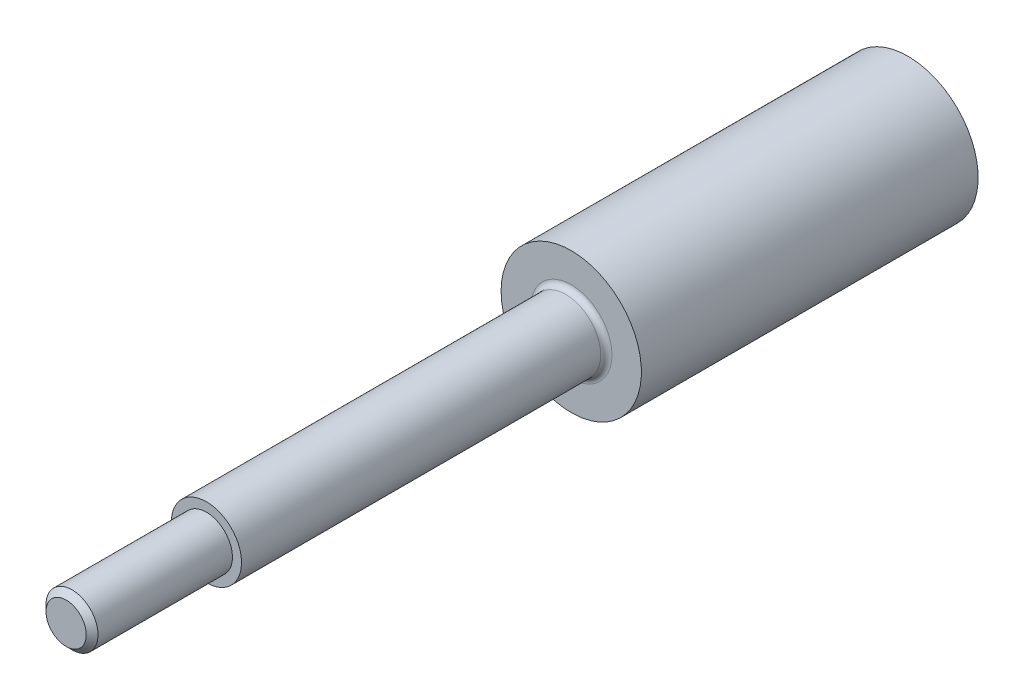
ISO-10303-21;
HEADER;
FILE_DESCRIPTION(('STEP AP214'),'2;1');
FILE_NAME('part.step','',(''),(''),'','','');
FILE_SCHEMA(('AUTOMOTIVE_DESIGN { 1 0 10303 214 1 1 1 1 }'));
ENDSEC;
DATA;
#1=APPLICATION_CONTEXT('core data for automotive mechanical design processes');
#2=APPLICATION_PROTOCOL_DEFINITION('international standard','automotive_design',2000,#1);
#3=PRODUCT_CONTEXT('',#1,'mechanical');
#4=PRODUCT('Part','Part','',(#3));
#5=PRODUCT_RELATED_PRODUCT_CATEGORY('part','',(#4));
#6=PRODUCT_DEFINITION_FORMATION('','',#4);
#7=PRODUCT_DEFINITION_CONTEXT('part definition',#1,'design');
#8=PRODUCT_DEFINITION('design','',#6,#7);
#9=PRODUCT_DEFINITION_SHAPE('','',#8);
#10=(LENGTH_UNIT() NAMED_UNIT(*) SI_UNIT(.MILLI.,.METRE.));
#11=(NAMED_UNIT(*) PLANE_ANGLE_UNIT() SI_UNIT($,.RADIAN.));
#12=(NAMED_UNIT(*) SI_UNIT($,.STERADIAN.) SOLID_ANGLE_UNIT());
#13=UNCERTAINTY_MEASURE_WITH_UNIT(LENGTH_MEASURE(1.E-05),#10,'distance_accuracy_value','');
#14=(GEOMETRIC_REPRESENTATION_CONTEXT(3) GLOBAL_UNCERTAINTY_ASSIGNED_CONTEXT((#13)) GLOBAL_UNIT_ASSIGNED_CONTEXT((#10,
#11,#12)) REPRESENTATION_CONTEXT('',''));
#15=CARTESIAN_POINT('',(0.,0.,0.));
#16=DIRECTION('',(0.,0.,1.));
#17=DIRECTION('',(1.,0.,0.));
#18=AXIS2_PLACEMENT_3D('',#15,#16,#17);
#19=CARTESIAN_POINT('',(0.,0.,18.));
#20=DIRECTION('',(0.,0.,-1.));
#21=DIRECTION('',(-1.,0.,0.));
#22=AXIS2_PLACEMENT_3D('',#19,#20,#21);
#23=CYLINDRICAL_SURFACE('',#22,1.25);
#24=CARTESIAN_POINT('',(0.,0.,0.2));
#25=DIRECTION('',(0.,0.,-1.));
#26=DIRECTION('',(-1.,0.,0.));
#27=AXIS2_PLACEMENT_3D('',#24,#25,#26);
#28=CIRCLE('',#27,1.25);
#29=CARTESIAN_POINT('',(-1.25,0.,0.2));
#30=VERTEX_POINT('',#29);
#31=EDGE_CURVE('E24',#30,#30,#28,.F.);
#32=ORIENTED_EDGE('',*,*,#31,.T.);
#33=EDGE_LOOP('',(#32));
#34=FACE_BOUND('',#33,.T.);
#35=CARTESIAN_POINT('',(0.,0.,13.));
#36=DIRECTION('',(0.,0.,-1.));
#37=DIRECTION('',(-1.,0.,0.));
#38=AXIS2_PLACEMENT_3D('',#35,#36,#37);
#39=CIRCLE('',#38,1.25);
#40=CARTESIAN_POINT('',(-1.25,0.,13.));
#41=VERTEX_POINT('',#40);
#42=EDGE_CURVE('E53',#41,#41,#39,.T.);
#43=ORIENTED_EDGE('',*,*,#42,.T.);
#44=EDGE_LOOP('',(#43));
#45=FACE_BOUND('',#44,.T.);
#46=ADVANCED_FACE('F17',(#34,#45),#23,.T.);
#47=CARTESIAN_POINT('',(0.,0.,18.));
#48=DIRECTION('',(0.,0.,-1.));
#49=DIRECTION('',(-1.,0.,0.));
#50=AXIS2_PLACEMENT_3D('',#47,#48,#49);
#51=CYLINDRICAL_SURFACE('',#50,0.9271);
#52=CARTESIAN_POINT('',(0.,0.,13.));
#53=DIRECTION('',(0.,0.,-1.));
#54=DIRECTION('',(-1.,0.,0.));
#55=AXIS2_PLACEMENT_3D('',#52,#53,#54);
#56=CIRCLE('',#55,0.9271);
#57=CARTESIAN_POINT('',(-0.9271,0.,13.));
#58=VERTEX_POINT('',#57);
#59=EDGE_CURVE('E56',#58,#58,#56,.T.);
#60=ORIENTED_EDGE('',*,*,#59,.F.);
#61=EDGE_LOOP('',(#60));
#62=FACE_BOUND('',#61,.T.);
#63=CARTESIAN_POINT('',(0.,0.,17.79045));
#64=DIRECTION('',(0.,0.,-1.));
#65=DIRECTION('',(-1.,0.,0.));
#66=AXIS2_PLACEMENT_3D('',#63,#64,#65);
#67=CIRCLE('',#66,0.9271);
#68=CARTESIAN_POINT('',(-0.9271,0.,17.79045));
#69=VERTEX_POINT('',#68);
#70=EDGE_CURVE('E46',#69,#69,#67,.T.);
#71=ORIENTED_EDGE('',*,*,#70,.T.);
#72=EDGE_LOOP('',(#71));
#73=FACE_BOUND('',#72,.T.);
#74=ADVANCED_FACE('F76',(#62,#73),#51,.T.);
#75=CARTESIAN_POINT('',(0.9271,0.,13.));
#76=DIRECTION('',(0.,0.,-1.));
#77=DIRECTION('',(-1.,0.,0.));
#78=AXIS2_PLACEMENT_3D('',#75,#76,#77);
#79=PLANE('',#78);
#80=ORIENTED_EDGE('',*,*,#42,.F.);
#81=EDGE_LOOP('',(#80));
#82=FACE_BOUND('',#81,.T.);
#83=ORIENTED_EDGE('',*,*,#59,.T.);
#84=EDGE_LOOP('',(#83));
#85=FACE_BOUND('',#84,.T.);
#86=ADVANCED_FACE('F81',(#82,#85),#79,.F.);
#87=CARTESIAN_POINT('',(0.,0.,18.));
#88=DIRECTION('',(0.,0.,-1.));
#89=DIRECTION('',(-1.,0.,0.));
#90=AXIS2_PLACEMENT_3D('',#87,#88,#89);
#91=CONICAL_SURFACE('',#90,0.71755,0.78539816339745);
#92=ORIENTED_EDGE('',*,*,#70,.F.);
#93=EDGE_LOOP('',(#92));
#94=FACE_BOUND('',#93,.T.);
#95=CARTESIAN_POINT('',(0.,0.,18.));
#96=DIRECTION('',(0.,0.,-1.));
#97=DIRECTION('',(-1.,0.,0.));
#98=AXIS2_PLACEMENT_3D('',#95,#96,#97);
#99=CIRCLE('',#98,0.71755);
#100=CARTESIAN_POINT('',(-0.71755,0.,18.));
#101=VERTEX_POINT('',#100);
#102=EDGE_CURVE('E50',#101,#101,#99,.T.);
#103=ORIENTED_EDGE('',*,*,#102,.T.);
#104=EDGE_LOOP('',(#103));
#105=FACE_BOUND('',#104,.T.);
#106=ADVANCED_FACE('F88',(#94,#105),#91,.T.);
#107=CARTESIAN_POINT('',(0.,0.,18.));
#108=DIRECTION('',(0.,0.,1.));
#109=DIRECTION('',(1.,0.,0.));
#110=AXIS2_PLACEMENT_3D('',#107,#108,#109);
#111=PLANE('',#110);
#112=ORIENTED_EDGE('',*,*,#102,.F.);
#113=EDGE_LOOP('',(#112));
#114=FACE_BOUND('',#113,.T.);
#115=ADVANCED_FACE('F85',(#114),#111,.T.);
#116=CARTESIAN_POINT('',(0.,0.,-12.));
#117=DIRECTION('',(0.,0.,1.));
#118=DIRECTION('',(1.,0.,0.));
#119=AXIS2_PLACEMENT_3D('',#116,#117,#118);
#120=CYLINDRICAL_SURFACE('',#119,2.5);
#121=CARTESIAN_POINT('',(0.,0.,-12.));
#122=DIRECTION('',(0.,0.,-1.));
#123=DIRECTION('',(-1.,0.,0.));
#124=AXIS2_PLACEMENT_3D('',#121,#122,#123);
#125=CIRCLE('',#124,2.5);
#126=CARTESIAN_POINT('',(-2.5,0.,-12.));
#127=VERTEX_POINT('',#126);
#128=EDGE_CURVE('E40',#127,#127,#125,.T.);
#129=ORIENTED_EDGE('',*,*,#128,.F.);
#130=EDGE_LOOP('',(#129));
#131=FACE_BOUND('',#130,.T.);
#132=CARTESIAN_POINT('',(0.,0.,0.));
#133=DIRECTION('',(0.,0.,-1.));
#134=DIRECTION('',(-1.,0.,0.));
#135=AXIS2_PLACEMENT_3D('',#132,#133,#134);
#136=CIRCLE('',#135,2.5);
#137=CARTESIAN_POINT('',(-2.5,0.,0.));
#138=VERTEX_POINT('',#137);
#139=EDGE_CURVE('E36',#138,#138,#136,.T.);
#140=ORIENTED_EDGE('',*,*,#139,.T.);
#141=EDGE_LOOP('',(#140));
#142=FACE_BOUND('',#141,.T.);
#143=ADVANCED_FACE('F87',(#131,#142),#120,.T.);
#144=CARTESIAN_POINT('',(0.,0.,-12.));
#145=DIRECTION('',(0.,0.,-1.));
#146=DIRECTION('',(-1.,0.,0.));
#147=AXIS2_PLACEMENT_3D('',#144,#145,#146);
#148=PLANE('',#147);
#149=CARTESIAN_POINT('',(0.,0.,-12.));
#150=DIRECTION('',(0.,0.,-1.));
#151=DIRECTION('',(-1.,0.,0.));
#152=AXIS2_PLACEMENT_3D('',#149,#150,#151);
#153=CIRCLE('',#152,0.8);
#154=CARTESIAN_POINT('',(-0.8,0.,-12.));
#155=VERTEX_POINT('',#154);
#156=EDGE_CURVE('E37',#155,#155,#153,.T.);
#157=ORIENTED_EDGE('',*,*,#156,.F.);
#158=EDGE_LOOP('',(#157));
#159=FACE_BOUND('',#158,.T.);
#160=ORIENTED_EDGE('',*,*,#128,.T.);
#161=EDGE_LOOP('',(#160));
#162=FACE_BOUND('',#161,.T.);
#163=ADVANCED_FACE('F71',(#159,#162),#148,.T.);
#164=CARTESIAN_POINT('',(0.,0.,0.));
#165=DIRECTION('',(0.,0.,-1.));
#166=DIRECTION('',(-1.,0.,0.));
#167=AXIS2_PLACEMENT_3D('',#164,#165,#166);
#168=PLANE('',#167);
#169=CARTESIAN_POINT('',(0.,0.,0.));
#170=DIRECTION('',(0.,0.,-1.));
#171=DIRECTION('',(-1.,0.,0.));
#172=AXIS2_PLACEMENT_3D('',#169,#170,#171);
#173=CIRCLE('',#172,1.45);
#174=CARTESIAN_POINT('',(-1.45,0.,0.));
#175=VERTEX_POINT('',#174);
#176=EDGE_CURVE('E11',#175,#175,#173,.T.);
#177=ORIENTED_EDGE('',*,*,#176,.T.);
#178=EDGE_LOOP('',(#177));
#179=FACE_BOUND('',#178,.T.);
#180=ORIENTED_EDGE('',*,*,#139,.F.);
#181=EDGE_LOOP('',(#180));
#182=FACE_BOUND('',#181,.T.);
#183=ADVANCED_FACE('F64',(#179,#182),#168,.F.);
#184=CARTESIAN_POINT('',(0.,0.,0.2));
#185=DIRECTION('',(0.,0.,-1.));
#186=DIRECTION('',(-1.,0.,0.));
#187=AXIS2_PLACEMENT_3D('',#184,#185,#186);
#188=TOROIDAL_SURFACE('',#187,1.45,0.2);
#189=ORIENTED_EDGE('',*,*,#176,.F.);
#190=EDGE_LOOP('',(#189));
#191=FACE_BOUND('',#190,.T.);
#192=ORIENTED_EDGE('',*,*,#31,.F.);
#193=EDGE_LOOP('',(#192));
#194=FACE_BOUND('',#193,.T.);
#195=ADVANCED_FACE('F19',(#191,#194),#188,.F.);
#196=CARTESIAN_POINT('',(0.,0.,-6.8));
#197=DIRECTION('',(0.,0.,-1.));
#198=DIRECTION('',(-1.,0.,0.));
#199=AXIS2_PLACEMENT_3D('',#196,#197,#198);
#200=CONICAL_SURFACE('',#199,0.8,1.02974425867665);
#201=CARTESIAN_POINT('',(0.,0.,-6.31931150477795));
#202=VERTEX_POINT('',#201);
#203=VERTEX_LOOP('',#202);
#204=FACE_BOUND('',#203,.T.);
#205=CARTESIAN_POINT('',(0.,0.,-6.8));
#206=DIRECTION('',(0.,0.,-1.));
#207=DIRECTION('',(-1.,0.,0.));
#208=AXIS2_PLACEMENT_3D('',#205,#206,#207);
#209=CIRCLE('',#208,0.8);
#210=CARTESIAN_POINT('',(-0.8,0.,-6.8));
#211=VERTEX_POINT('',#210);
#212=EDGE_CURVE('E34',#211,#211,#209,.T.);
#213=ORIENTED_EDGE('',*,*,#212,.T.);
#214=EDGE_LOOP('',(#213));
#215=FACE_BOUND('',#214,.T.);
#216=ADVANCED_FACE('F27',(#204,#215),#200,.F.);
#217=CARTESIAN_POINT('',(0.,0.,-12.));
#218=DIRECTION('',(0.,0.,-1.));
#219=DIRECTION('',(-1.,0.,0.));
#220=AXIS2_PLACEMENT_3D('',#217,#218,#219);
#221=CYLINDRICAL_SURFACE('',#220,0.8);
#222=ORIENTED_EDGE('',*,*,#212,.F.);
#223=EDGE_LOOP('',(#222));
#224=FACE_BOUND('',#223,.T.);
#225=ORIENTED_EDGE('',*,*,#156,.T.);
#226=EDGE_LOOP('',(#225));
#227=FACE_BOUND('',#226,.T.);
#228=ADVANCED_FACE('F30',(#224,#227),#221,.F.);
#229=CLOSED_SHELL('',(#46,#74,#86,#106,#115,#143,#163,#183,#195,#216,#228));
#230=MANIFOLD_SOLID_BREP('B1',#229);
#231=ADVANCED_BREP_SHAPE_REPRESENTATION('',(#18,#230),#14);
#232=SHAPE_DEFINITION_REPRESENTATION(#9,#231);
ENDSEC;
END-ISO-10303-21;
